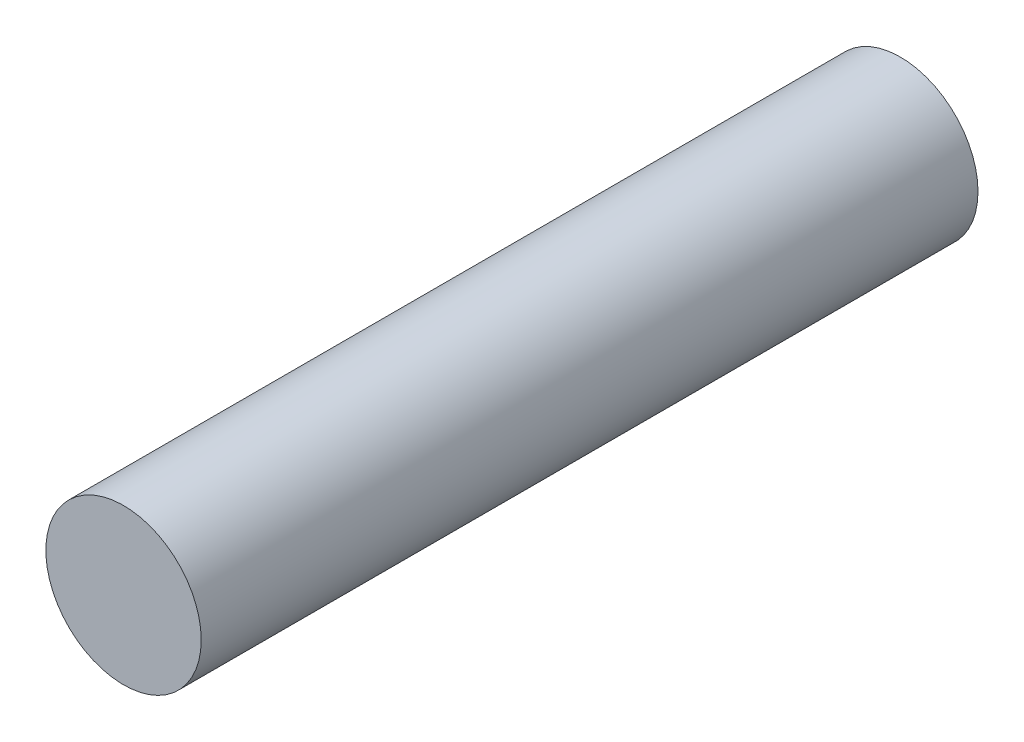
ISO-10303-21;
HEADER;
FILE_DESCRIPTION(('STEP AP214'),'2;1');
FILE_NAME('part.step','',(''),(''),'','','');
FILE_SCHEMA(('AUTOMOTIVE_DESIGN { 1 0 10303 214 1 1 1 1 }'));
ENDSEC;
DATA;
#1=APPLICATION_CONTEXT('core data for automotive mechanical design processes');
#2=APPLICATION_PROTOCOL_DEFINITION('international standard','automotive_design',2000,#1);
#3=PRODUCT_CONTEXT('',#1,'mechanical');
#4=PRODUCT('Part','Part','',(#3));
#5=PRODUCT_RELATED_PRODUCT_CATEGORY('part','',(#4));
#6=PRODUCT_DEFINITION_FORMATION('','',#4);
#7=PRODUCT_DEFINITION_CONTEXT('part definition',#1,'design');
#8=PRODUCT_DEFINITION('design','',#6,#7);
#9=PRODUCT_DEFINITION_SHAPE('','',#8);
#10=(LENGTH_UNIT() NAMED_UNIT(*) SI_UNIT(.MILLI.,.METRE.));
#11=(NAMED_UNIT(*) PLANE_ANGLE_UNIT() SI_UNIT($,.RADIAN.));
#12=(NAMED_UNIT(*) SI_UNIT($,.STERADIAN.) SOLID_ANGLE_UNIT());
#13=UNCERTAINTY_MEASURE_WITH_UNIT(LENGTH_MEASURE(1.E-05),#10,'distance_accuracy_value','');
#14=(GEOMETRIC_REPRESENTATION_CONTEXT(3) GLOBAL_UNCERTAINTY_ASSIGNED_CONTEXT((#13)) GLOBAL_UNIT_ASSIGNED_CONTEXT((#10,
#11,#12)) REPRESENTATION_CONTEXT('',''));
#15=CARTESIAN_POINT('',(0.,0.,0.));
#16=DIRECTION('',(0.,0.,1.));
#17=DIRECTION('',(1.,0.,0.));
#18=AXIS2_PLACEMENT_3D('',#15,#16,#17);
#19=CARTESIAN_POINT('',(0.,0.,80.));
#20=DIRECTION('',(0.,0.,-1.));
#21=DIRECTION('',(-1.,0.,0.));
#22=AXIS2_PLACEMENT_3D('',#19,#20,#21);
#23=CYLINDRICAL_SURFACE('',#22,8.);
#24=CARTESIAN_POINT('',(0.,0.,80.));
#25=DIRECTION('',(0.,0.,1.));
#26=DIRECTION('',(1.,0.,0.));
#27=AXIS2_PLACEMENT_3D('',#24,#25,#26);
#28=CIRCLE('',#27,8.);
#29=CARTESIAN_POINT('',(8.,0.,80.));
#30=VERTEX_POINT('',#29);
#31=EDGE_CURVE('E10',#30,#30,#28,.T.);
#32=ORIENTED_EDGE('',*,*,#31,.F.);
#33=EDGE_LOOP('',(#32));
#34=FACE_BOUND('',#33,.T.);
#35=CARTESIAN_POINT('',(0.,0.,0.));
#36=DIRECTION('',(0.,0.,1.));
#37=DIRECTION('',(1.,0.,0.));
#38=AXIS2_PLACEMENT_3D('',#35,#36,#37);
#39=CIRCLE('',#38,8.);
#40=CARTESIAN_POINT('',(8.,0.,0.));
#41=VERTEX_POINT('',#40);
#42=EDGE_CURVE('E40',#41,#41,#39,.T.);
#43=ORIENTED_EDGE('',*,*,#42,.T.);
#44=EDGE_LOOP('',(#43));
#45=FACE_BOUND('',#44,.T.);
#46=ADVANCED_FACE('F37',(#34,#45),#23,.T.);
#47=CARTESIAN_POINT('',(0.,0.,80.));
#48=DIRECTION('',(0.,0.,1.));
#49=DIRECTION('',(1.,0.,0.));
#50=AXIS2_PLACEMENT_3D('',#47,#48,#49);
#51=PLANE('',#50);
#52=ORIENTED_EDGE('',*,*,#31,.T.);
#53=EDGE_LOOP('',(#52));
#54=FACE_BOUND('',#53,.T.);
#55=ADVANCED_FACE('F71',(#54),#51,.T.);
#56=CARTESIAN_POINT('',(0.,0.,0.));
#57=DIRECTION('',(0.,0.,1.));
#58=DIRECTION('',(1.,0.,0.));
#59=AXIS2_PLACEMENT_3D('',#56,#57,#58);
#60=PLANE('',#59);
#61=CARTESIAN_POINT('',(0.,0.,0.));
#62=DIRECTION('',(0.,0.,1.));
#63=DIRECTION('',(1.,0.,0.));
#64=AXIS2_PLACEMENT_3D('',#61,#62,#63);
#65=CIRCLE('',#64,4.);
#66=CARTESIAN_POINT('',(4.,0.,0.));
#67=VERTEX_POINT('',#66);
#68=EDGE_CURVE('E51',#67,#67,#65,.T.);
#69=ORIENTED_EDGE('',*,*,#68,.T.);
#70=EDGE_LOOP('',(#69));
#71=FACE_BOUND('',#70,.T.);
#72=ORIENTED_EDGE('',*,*,#42,.F.);
#73=EDGE_LOOP('',(#72));
#74=FACE_BOUND('',#73,.T.);
#75=ADVANCED_FACE('F68',(#71,#74),#60,.F.);
#76=CARTESIAN_POINT('',(0.,0.,30.));
#77=DIRECTION('',(0.,0.,-1.));
#78=DIRECTION('',(-1.,0.,0.));
#79=AXIS2_PLACEMENT_3D('',#76,#77,#78);
#80=CYLINDRICAL_SURFACE('',#79,4.);
#81=CARTESIAN_POINT('',(0.,0.,30.));
#82=DIRECTION('',(0.,0.,1.));
#83=DIRECTION('',(1.,0.,0.));
#84=AXIS2_PLACEMENT_3D('',#81,#82,#83);
#85=CIRCLE('',#84,4.);
#86=CARTESIAN_POINT('',(4.,0.,30.));
#87=VERTEX_POINT('',#86);
#88=EDGE_CURVE('E49',#87,#87,#85,.T.);
#89=ORIENTED_EDGE('',*,*,#88,.T.);
#90=EDGE_LOOP('',(#89));
#91=FACE_BOUND('',#90,.T.);
#92=ORIENTED_EDGE('',*,*,#68,.F.);
#93=EDGE_LOOP('',(#92));
#94=FACE_BOUND('',#93,.T.);
#95=ADVANCED_FACE('F59',(#91,#94),#80,.F.);
#96=CARTESIAN_POINT('',(0.,0.,30.));
#97=DIRECTION('',(0.,0.,1.));
#98=DIRECTION('',(1.,0.,0.));
#99=AXIS2_PLACEMENT_3D('',#96,#97,#98);
#100=PLANE('',#99);
#101=ORIENTED_EDGE('',*,*,#88,.F.);
#102=EDGE_LOOP('',(#101));
#103=FACE_BOUND('',#102,.T.);
#104=ADVANCED_FACE('F62',(#103),#100,.F.);
#105=CLOSED_SHELL('',(#46,#55,#75,#95,#104));
#106=MANIFOLD_SOLID_BREP('B2',#105);
#107=ADVANCED_BREP_SHAPE_REPRESENTATION('',(#18,#106),#14);
#108=SHAPE_DEFINITION_REPRESENTATION(#9,#107);
ENDSEC;
END-ISO-10303-21;
